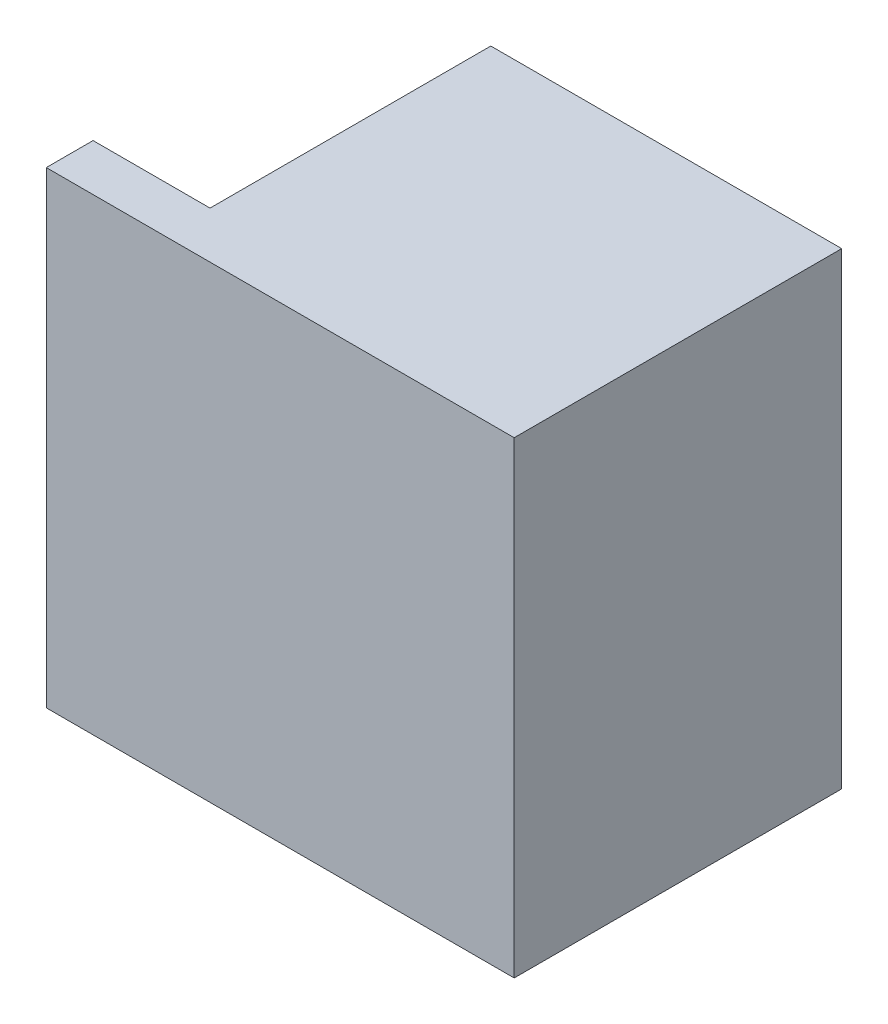
ISO-10303-21;
HEADER;
FILE_DESCRIPTION(('STEP AP214'),'2;1');
FILE_NAME('part.step','',(''),(''),'','','');
FILE_SCHEMA(('AUTOMOTIVE_DESIGN { 1 0 10303 214 1 1 1 1 }'));
ENDSEC;
DATA;
#1=APPLICATION_CONTEXT('core data for automotive mechanical design processes');
#2=APPLICATION_PROTOCOL_DEFINITION('international standard','automotive_design',2000,#1);
#3=PRODUCT_CONTEXT('',#1,'mechanical');
#4=PRODUCT('Part','Part','',(#3));
#5=PRODUCT_RELATED_PRODUCT_CATEGORY('part','',(#4));
#6=PRODUCT_DEFINITION_FORMATION('','',#4);
#7=PRODUCT_DEFINITION_CONTEXT('part definition',#1,'design');
#8=PRODUCT_DEFINITION('design','',#6,#7);
#9=PRODUCT_DEFINITION_SHAPE('','',#8);
#10=(LENGTH_UNIT() NAMED_UNIT(*) SI_UNIT(.MILLI.,.METRE.));
#11=(NAMED_UNIT(*) PLANE_ANGLE_UNIT() SI_UNIT($,.RADIAN.));
#12=(NAMED_UNIT(*) SI_UNIT($,.STERADIAN.) SOLID_ANGLE_UNIT());
#13=UNCERTAINTY_MEASURE_WITH_UNIT(LENGTH_MEASURE(1.E-05),#10,'distance_accuracy_value','');
#14=(GEOMETRIC_REPRESENTATION_CONTEXT(3) GLOBAL_UNCERTAINTY_ASSIGNED_CONTEXT((#13)) GLOBAL_UNIT_ASSIGNED_CONTEXT((#10,
#11,#12)) REPRESENTATION_CONTEXT('',''));
#15=CARTESIAN_POINT('',(0.,0.,0.));
#16=DIRECTION('',(0.,0.,1.));
#17=DIRECTION('',(1.,0.,0.));
#18=AXIS2_PLACEMENT_3D('',#15,#16,#17);
#19=CARTESIAN_POINT('',(-10.,10.,14.));
#20=DIRECTION('',(1.,0.,0.));
#21=DIRECTION('',(0.,1.,0.));
#22=AXIS2_PLACEMENT_3D('',#19,#20,#21);
#23=PLANE('',#22);
#24=DIRECTION('',(0.,-1.,0.));
#25=VECTOR('',#24,1.);
#26=CARTESIAN_POINT('',(-10.,10.,12.));
#27=LINE('',#26,#25);
#28=CARTESIAN_POINT('',(-10.,10.,12.));
#29=VERTEX_POINT('',#28);
#30=CARTESIAN_POINT('',(-10.,-10.,12.));
#31=VERTEX_POINT('',#30);
#32=EDGE_CURVE('E237',#29,#31,#27,.T.);
#33=ORIENTED_EDGE('',*,*,#32,.T.);
#34=DIRECTION('',(0.,0.,-1.));
#35=VECTOR('',#34,1.);
#36=CARTESIAN_POINT('',(-10.,-10.,14.));
#37=LINE('',#36,#35);
#38=CARTESIAN_POINT('',(-10.,-10.,14.));
#39=VERTEX_POINT('',#38);
#40=EDGE_CURVE('E12',#39,#31,#37,.T.);
#41=ORIENTED_EDGE('',*,*,#40,.F.);
#42=DIRECTION('',(0.,-1.,0.));
#43=VECTOR('',#42,1.);
#44=CARTESIAN_POINT('',(-10.,10.,14.));
#45=LINE('',#44,#43);
#46=CARTESIAN_POINT('',(-10.,10.,14.));
#47=VERTEX_POINT('',#46);
#48=EDGE_CURVE('E188',#47,#39,#45,.T.);
#49=ORIENTED_EDGE('',*,*,#48,.F.);
#50=DIRECTION('',(0.,0.,-1.));
#51=VECTOR('',#50,1.);
#52=CARTESIAN_POINT('',(-10.,10.,14.));
#53=LINE('',#52,#51);
#54=EDGE_CURVE('E195',#47,#29,#53,.T.);
#55=ORIENTED_EDGE('',*,*,#54,.T.);
#56=EDGE_LOOP('',(#33,#41,#49,#55));
#57=FACE_BOUND('',#56,.T.);
#58=ADVANCED_FACE('F35',(#57),#23,.F.);
#59=CARTESIAN_POINT('',(10.,-10.,14.));
#60=DIRECTION('',(0.,1.,0.));
#61=DIRECTION('',(-1.,0.,0.));
#62=AXIS2_PLACEMENT_3D('',#59,#60,#61);
#63=PLANE('',#62);
#64=DIRECTION('',(1.,0.,0.));
#65=VECTOR('',#64,1.);
#66=CARTESIAN_POINT('',(-10.,-10.,12.));
#67=LINE('',#66,#65);
#68=CARTESIAN_POINT('',(5.,-10.,12.));
#69=VERTEX_POINT('',#68);
#70=EDGE_CURVE('E234',#31,#69,#67,.T.);
#71=ORIENTED_EDGE('',*,*,#70,.T.);
#72=DIRECTION('',(0.,0.,-1.));
#73=VECTOR('',#72,1.);
#74=CARTESIAN_POINT('',(5.,-10.,40.9072480941474));
#75=LINE('',#74,#73);
#76=CARTESIAN_POINT('',(5.,-10.,0.));
#77=VERTEX_POINT('',#76);
#78=EDGE_CURVE('E171',#69,#77,#75,.T.);
#79=ORIENTED_EDGE('',*,*,#78,.T.);
#80=DIRECTION('',(1.,0.,0.));
#81=VECTOR('',#80,1.);
#82=CARTESIAN_POINT('',(10.,-10.,0.));
#83=LINE('',#82,#81);
#84=CARTESIAN_POINT('',(10.,-10.,0.));
#85=VERTEX_POINT('',#84);
#86=EDGE_CURVE('E186',#77,#85,#83,.T.);
#87=ORIENTED_EDGE('',*,*,#86,.T.);
#88=DIRECTION('',(0.,0.,-1.));
#89=VECTOR('',#88,1.);
#90=CARTESIAN_POINT('',(10.,-10.,14.));
#91=LINE('',#90,#89);
#92=CARTESIAN_POINT('',(10.,-10.,14.));
#93=VERTEX_POINT('',#92);
#94=EDGE_CURVE('E42',#93,#85,#91,.T.);
#95=ORIENTED_EDGE('',*,*,#94,.F.);
#96=DIRECTION('',(1.,0.,0.));
#97=VECTOR('',#96,1.);
#98=CARTESIAN_POINT('',(10.,-10.,14.));
#99=LINE('',#98,#97);
#100=EDGE_CURVE('E81',#39,#93,#99,.T.);
#101=ORIENTED_EDGE('',*,*,#100,.F.);
#102=ORIENTED_EDGE('',*,*,#40,.T.);
#103=EDGE_LOOP('',(#71,#79,#87,#95,#101,#102));
#104=FACE_BOUND('',#103,.T.);
#105=ADVANCED_FACE('F225',(#104),#63,.F.);
#106=CARTESIAN_POINT('',(10.,10.,14.));
#107=DIRECTION('',(-1.,0.,0.));
#108=DIRECTION('',(0.,-1.,0.));
#109=AXIS2_PLACEMENT_3D('',#106,#107,#108);
#110=PLANE('',#109);
#111=DIRECTION('',(0.,1.,0.));
#112=VECTOR('',#111,1.);
#113=CARTESIAN_POINT('',(10.,10.,0.));
#114=LINE('',#113,#112);
#115=CARTESIAN_POINT('',(10.,10.,0.));
#116=VERTEX_POINT('',#115);
#117=EDGE_CURVE('E74',#85,#116,#114,.T.);
#118=ORIENTED_EDGE('',*,*,#117,.T.);
#119=DIRECTION('',(0.,0.,-1.));
#120=VECTOR('',#119,1.);
#121=CARTESIAN_POINT('',(10.,10.,14.));
#122=LINE('',#121,#120);
#123=CARTESIAN_POINT('',(10.,10.,14.));
#124=VERTEX_POINT('',#123);
#125=EDGE_CURVE('E201',#124,#116,#122,.T.);
#126=ORIENTED_EDGE('',*,*,#125,.F.);
#127=DIRECTION('',(0.,1.,0.));
#128=VECTOR('',#127,1.);
#129=CARTESIAN_POINT('',(10.,10.,14.));
#130=LINE('',#129,#128);
#131=EDGE_CURVE('E192',#93,#124,#130,.T.);
#132=ORIENTED_EDGE('',*,*,#131,.F.);
#133=ORIENTED_EDGE('',*,*,#94,.T.);
#134=EDGE_LOOP('',(#118,#126,#132,#133));
#135=FACE_BOUND('',#134,.T.);
#136=ADVANCED_FACE('F203',(#135),#110,.F.);
#137=CARTESIAN_POINT('',(10.,10.,14.));
#138=DIRECTION('',(0.,-1.,0.));
#139=DIRECTION('',(1.,0.,0.));
#140=AXIS2_PLACEMENT_3D('',#137,#138,#139);
#141=PLANE('',#140);
#142=DIRECTION('',(-1.,0.,0.));
#143=VECTOR('',#142,1.);
#144=CARTESIAN_POINT('',(10.,10.,0.));
#145=LINE('',#144,#143);
#146=CARTESIAN_POINT('',(-5.,10.,0.));
#147=VERTEX_POINT('',#146);
#148=EDGE_CURVE('E190',#116,#147,#145,.T.);
#149=ORIENTED_EDGE('',*,*,#148,.T.);
#150=DIRECTION('',(0.,0.,-1.));
#151=VECTOR('',#150,1.);
#152=CARTESIAN_POINT('',(-5.,10.,40.9072480941474));
#153=LINE('',#152,#151);
#154=CARTESIAN_POINT('',(-5.,10.,12.));
#155=VERTEX_POINT('',#154);
#156=EDGE_CURVE('E49',#155,#147,#153,.T.);
#157=ORIENTED_EDGE('',*,*,#156,.F.);
#158=DIRECTION('',(-1.,0.,0.));
#159=VECTOR('',#158,1.);
#160=CARTESIAN_POINT('',(-10.,10.,12.));
#161=LINE('',#160,#159);
#162=EDGE_CURVE('E187',#155,#29,#161,.T.);
#163=ORIENTED_EDGE('',*,*,#162,.T.);
#164=ORIENTED_EDGE('',*,*,#54,.F.);
#165=DIRECTION('',(-1.,0.,0.));
#166=VECTOR('',#165,1.);
#167=CARTESIAN_POINT('',(10.,10.,14.));
#168=LINE('',#167,#166);
#169=EDGE_CURVE('E58',#124,#47,#168,.T.);
#170=ORIENTED_EDGE('',*,*,#169,.F.);
#171=ORIENTED_EDGE('',*,*,#125,.T.);
#172=EDGE_LOOP('',(#149,#157,#163,#164,#170,#171));
#173=FACE_BOUND('',#172,.T.);
#174=ADVANCED_FACE('F206',(#173),#141,.F.);
#175=CARTESIAN_POINT('',(0.,0.,14.));
#176=DIRECTION('',(0.,0.,-1.));
#177=DIRECTION('',(-1.,0.,0.));
#178=AXIS2_PLACEMENT_3D('',#175,#176,#177);
#179=PLANE('',#178);
#180=ORIENTED_EDGE('',*,*,#48,.T.);
#181=ORIENTED_EDGE('',*,*,#100,.T.);
#182=ORIENTED_EDGE('',*,*,#131,.T.);
#183=ORIENTED_EDGE('',*,*,#169,.T.);
#184=EDGE_LOOP('',(#180,#181,#182,#183));
#185=FACE_BOUND('',#184,.T.);
#186=ADVANCED_FACE('F213',(#185),#179,.F.);
#187=CARTESIAN_POINT('',(0.,0.,0.));
#188=DIRECTION('',(0.,0.,-1.));
#189=DIRECTION('',(-1.,0.,0.));
#190=AXIS2_PLACEMENT_3D('',#187,#188,#189);
#191=PLANE('',#190);
#192=DIRECTION('',(0.,-1.,0.));
#193=VECTOR('',#192,1.);
#194=CARTESIAN_POINT('',(5.,-8.,0.));
#195=LINE('',#194,#193);
#196=CARTESIAN_POINT('',(5.,-8.,0.));
#197=VERTEX_POINT('',#196);
#198=EDGE_CURVE('E169',#197,#77,#195,.T.);
#199=ORIENTED_EDGE('',*,*,#198,.F.);
#200=DIRECTION('',(-1.,0.,0.));
#201=VECTOR('',#200,1.);
#202=CARTESIAN_POINT('',(5.,-8.,0.));
#203=LINE('',#202,#201);
#204=CARTESIAN_POINT('',(8.,-8.,0.));
#205=VERTEX_POINT('',#204);
#206=EDGE_CURVE('E166',#205,#197,#203,.T.);
#207=ORIENTED_EDGE('',*,*,#206,.F.);
#208=DIRECTION('',(0.,-1.,0.));
#209=VECTOR('',#208,1.);
#210=CARTESIAN_POINT('',(8.,8.,0.));
#211=LINE('',#210,#209);
#212=CARTESIAN_POINT('',(8.,8.,0.));
#213=VERTEX_POINT('',#212);
#214=EDGE_CURVE('E163',#213,#205,#211,.T.);
#215=ORIENTED_EDGE('',*,*,#214,.F.);
#216=DIRECTION('',(1.,0.,0.));
#217=VECTOR('',#216,1.);
#218=CARTESIAN_POINT('',(-3.,8.,0.));
#219=LINE('',#218,#217);
#220=CARTESIAN_POINT('',(-3.,8.,0.));
#221=VERTEX_POINT('',#220);
#222=EDGE_CURVE('E157',#221,#213,#219,.T.);
#223=ORIENTED_EDGE('',*,*,#222,.F.);
#224=DIRECTION('',(0.,1.,0.));
#225=VECTOR('',#224,1.);
#226=CARTESIAN_POINT('',(-3.,8.,0.));
#227=LINE('',#226,#225);
#228=CARTESIAN_POINT('',(-3.,3.,0.));
#229=VERTEX_POINT('',#228);
#230=EDGE_CURVE('E155',#229,#221,#227,.T.);
#231=ORIENTED_EDGE('',*,*,#230,.F.);
#232=DIRECTION('',(1.,0.,0.));
#233=VECTOR('',#232,1.);
#234=CARTESIAN_POINT('',(-3.,3.,0.));
#235=LINE('',#234,#233);
#236=CARTESIAN_POINT('',(-5.,3.,0.));
#237=VERTEX_POINT('',#236);
#238=EDGE_CURVE('E138',#237,#229,#235,.T.);
#239=ORIENTED_EDGE('',*,*,#238,.F.);
#240=DIRECTION('',(0.,-1.,0.));
#241=VECTOR('',#240,1.);
#242=CARTESIAN_POINT('',(-5.,3.,0.));
#243=LINE('',#242,#241);
#244=EDGE_CURVE('E145',#147,#237,#243,.T.);
#245=ORIENTED_EDGE('',*,*,#244,.F.);
#246=ORIENTED_EDGE('',*,*,#148,.F.);
#247=ORIENTED_EDGE('',*,*,#117,.F.);
#248=ORIENTED_EDGE('',*,*,#86,.F.);
#249=EDGE_LOOP('',(#199,#207,#215,#223,#231,#239,#245,#246,#247,#248));
#250=FACE_BOUND('',#249,.T.);
#251=ADVANCED_FACE('F152',(#250),#191,.T.);
#252=CARTESIAN_POINT('',(5.,-8.,40.9072480941474));
#253=DIRECTION('',(1.,0.,0.));
#254=DIRECTION('',(0.,0.,-1.));
#255=AXIS2_PLACEMENT_3D('',#252,#253,#254);
#256=PLANE('',#255);
#257=DIRECTION('',(0.,1.,0.));
#258=VECTOR('',#257,1.);
#259=CARTESIAN_POINT('',(5.,-8.,12.));
#260=LINE('',#259,#258);
#261=CARTESIAN_POINT('',(5.,-8.,12.));
#262=VERTEX_POINT('',#261);
#263=EDGE_CURVE('E238',#69,#262,#260,.T.);
#264=ORIENTED_EDGE('',*,*,#263,.T.);
#265=DIRECTION('',(0.,0.,-1.));
#266=VECTOR('',#265,1.);
#267=CARTESIAN_POINT('',(5.,-8.,40.9072480941474));
#268=LINE('',#267,#266);
#269=EDGE_CURVE('E174',#262,#197,#268,.T.);
#270=ORIENTED_EDGE('',*,*,#269,.T.);
#271=ORIENTED_EDGE('',*,*,#198,.T.);
#272=ORIENTED_EDGE('',*,*,#78,.F.);
#273=EDGE_LOOP('',(#264,#270,#271,#272));
#274=FACE_BOUND('',#273,.T.);
#275=ADVANCED_FACE('F220',(#274),#256,.F.);
#276=CARTESIAN_POINT('',(5.,-8.,40.9072480941474));
#277=DIRECTION('',(0.,-1.,0.));
#278=DIRECTION('',(1.,0.,0.));
#279=AXIS2_PLACEMENT_3D('',#276,#277,#278);
#280=PLANE('',#279);
#281=DIRECTION('',(1.,0.,0.));
#282=VECTOR('',#281,1.);
#283=CARTESIAN_POINT('',(5.,-8.,12.));
#284=LINE('',#283,#282);
#285=CARTESIAN_POINT('',(8.,-8.,12.));
#286=VERTEX_POINT('',#285);
#287=EDGE_CURVE('E241',#262,#286,#284,.T.);
#288=ORIENTED_EDGE('',*,*,#287,.T.);
#289=DIRECTION('',(0.,0.,-1.));
#290=VECTOR('',#289,1.);
#291=CARTESIAN_POINT('',(8.,-8.,40.9072480941474));
#292=LINE('',#291,#290);
#293=EDGE_CURVE('E176',#286,#205,#292,.T.);
#294=ORIENTED_EDGE('',*,*,#293,.T.);
#295=ORIENTED_EDGE('',*,*,#206,.T.);
#296=ORIENTED_EDGE('',*,*,#269,.F.);
#297=EDGE_LOOP('',(#288,#294,#295,#296));
#298=FACE_BOUND('',#297,.T.);
#299=ADVANCED_FACE('F265',(#298),#280,.F.);
#300=CARTESIAN_POINT('',(8.,8.,40.9072480941474));
#301=DIRECTION('',(1.,0.,0.));
#302=DIRECTION('',(0.,1.,0.));
#303=AXIS2_PLACEMENT_3D('',#300,#301,#302);
#304=PLANE('',#303);
#305=DIRECTION('',(0.,1.,0.));
#306=VECTOR('',#305,1.);
#307=CARTESIAN_POINT('',(8.,8.,12.));
#308=LINE('',#307,#306);
#309=CARTESIAN_POINT('',(8.,8.,12.));
#310=VERTEX_POINT('',#309);
#311=EDGE_CURVE('E245',#286,#310,#308,.T.);
#312=ORIENTED_EDGE('',*,*,#311,.T.);
#313=DIRECTION('',(0.,0.,-1.));
#314=VECTOR('',#313,1.);
#315=CARTESIAN_POINT('',(8.,8.,40.9072480941474));
#316=LINE('',#315,#314);
#317=EDGE_CURVE('E178',#310,#213,#316,.T.);
#318=ORIENTED_EDGE('',*,*,#317,.T.);
#319=ORIENTED_EDGE('',*,*,#214,.T.);
#320=ORIENTED_EDGE('',*,*,#293,.F.);
#321=EDGE_LOOP('',(#312,#318,#319,#320));
#322=FACE_BOUND('',#321,.T.);
#323=ADVANCED_FACE('F269',(#322),#304,.F.);
#324=CARTESIAN_POINT('',(-3.,8.,40.9072480941474));
#325=DIRECTION('',(0.,1.,0.));
#326=DIRECTION('',(-1.,0.,0.));
#327=AXIS2_PLACEMENT_3D('',#324,#325,#326);
#328=PLANE('',#327);
#329=DIRECTION('',(-1.,0.,0.));
#330=VECTOR('',#329,1.);
#331=CARTESIAN_POINT('',(-3.,8.,12.));
#332=LINE('',#331,#330);
#333=CARTESIAN_POINT('',(-3.,8.,12.));
#334=VERTEX_POINT('',#333);
#335=EDGE_CURVE('E247',#310,#334,#332,.T.);
#336=ORIENTED_EDGE('',*,*,#335,.T.);
#337=DIRECTION('',(0.,0.,-1.));
#338=VECTOR('',#337,1.);
#339=CARTESIAN_POINT('',(-3.,8.,40.9072480941474));
#340=LINE('',#339,#338);
#341=EDGE_CURVE('E180',#334,#221,#340,.T.);
#342=ORIENTED_EDGE('',*,*,#341,.T.);
#343=ORIENTED_EDGE('',*,*,#222,.T.);
#344=ORIENTED_EDGE('',*,*,#317,.F.);
#345=EDGE_LOOP('',(#336,#342,#343,#344));
#346=FACE_BOUND('',#345,.T.);
#347=ADVANCED_FACE('F273',(#346),#328,.F.);
#348=CARTESIAN_POINT('',(-3.,8.,40.9072480941474));
#349=DIRECTION('',(-1.,0.,0.));
#350=DIRECTION('',(0.,-1.,0.));
#351=AXIS2_PLACEMENT_3D('',#348,#349,#350);
#352=PLANE('',#351);
#353=DIRECTION('',(0.,-1.,0.));
#354=VECTOR('',#353,1.);
#355=CARTESIAN_POINT('',(-3.,8.,12.));
#356=LINE('',#355,#354);
#357=CARTESIAN_POINT('',(-3.,3.,12.));
#358=VERTEX_POINT('',#357);
#359=EDGE_CURVE('E249',#334,#358,#356,.T.);
#360=ORIENTED_EDGE('',*,*,#359,.T.);
#361=DIRECTION('',(0.,0.,-1.));
#362=VECTOR('',#361,1.);
#363=CARTESIAN_POINT('',(-3.,3.,40.9072480941474));
#364=LINE('',#363,#362);
#365=EDGE_CURVE('E143',#358,#229,#364,.T.);
#366=ORIENTED_EDGE('',*,*,#365,.T.);
#367=ORIENTED_EDGE('',*,*,#230,.T.);
#368=ORIENTED_EDGE('',*,*,#341,.F.);
#369=EDGE_LOOP('',(#360,#366,#367,#368));
#370=FACE_BOUND('',#369,.T.);
#371=ADVANCED_FACE('F254',(#370),#352,.F.);
#372=CARTESIAN_POINT('',(-3.,3.,40.9072480941474));
#373=DIRECTION('',(0.,1.,0.));
#374=DIRECTION('',(0.,0.,1.));
#375=AXIS2_PLACEMENT_3D('',#372,#373,#374);
#376=PLANE('',#375);
#377=DIRECTION('',(-1.,0.,0.));
#378=VECTOR('',#377,1.);
#379=CARTESIAN_POINT('',(-3.,3.,12.));
#380=LINE('',#379,#378);
#381=CARTESIAN_POINT('',(-5.,3.,12.));
#382=VERTEX_POINT('',#381);
#383=EDGE_CURVE('E141',#358,#382,#380,.T.);
#384=ORIENTED_EDGE('',*,*,#383,.T.);
#385=DIRECTION('',(0.,0.,-1.));
#386=VECTOR('',#385,1.);
#387=CARTESIAN_POINT('',(-5.,3.,40.9072480941474));
#388=LINE('',#387,#386);
#389=EDGE_CURVE('E134',#382,#237,#388,.T.);
#390=ORIENTED_EDGE('',*,*,#389,.T.);
#391=ORIENTED_EDGE('',*,*,#238,.T.);
#392=ORIENTED_EDGE('',*,*,#365,.F.);
#393=EDGE_LOOP('',(#384,#390,#391,#392));
#394=FACE_BOUND('',#393,.T.);
#395=ADVANCED_FACE('F135',(#394),#376,.F.);
#396=CARTESIAN_POINT('',(-5.,3.,40.9072480941474));
#397=DIRECTION('',(1.,0.,0.));
#398=DIRECTION('',(0.,0.,-1.));
#399=AXIS2_PLACEMENT_3D('',#396,#397,#398);
#400=PLANE('',#399);
#401=DIRECTION('',(0.,1.,0.));
#402=VECTOR('',#401,1.);
#403=CARTESIAN_POINT('',(-5.,3.,12.));
#404=LINE('',#403,#402);
#405=EDGE_CURVE('E184',#382,#155,#404,.T.);
#406=ORIENTED_EDGE('',*,*,#405,.T.);
#407=ORIENTED_EDGE('',*,*,#156,.T.);
#408=ORIENTED_EDGE('',*,*,#244,.T.);
#409=ORIENTED_EDGE('',*,*,#389,.F.);
#410=EDGE_LOOP('',(#406,#407,#408,#409));
#411=FACE_BOUND('',#410,.T.);
#412=ADVANCED_FACE('F146',(#411),#400,.F.);
#413=CARTESIAN_POINT('',(0.,0.,12.));
#414=DIRECTION('',(0.,0.,-1.));
#415=DIRECTION('',(-1.,0.,0.));
#416=AXIS2_PLACEMENT_3D('',#413,#414,#415);
#417=PLANE('',#416);
#418=ORIENTED_EDGE('',*,*,#162,.F.);
#419=ORIENTED_EDGE('',*,*,#405,.F.);
#420=ORIENTED_EDGE('',*,*,#383,.F.);
#421=ORIENTED_EDGE('',*,*,#359,.F.);
#422=ORIENTED_EDGE('',*,*,#335,.F.);
#423=ORIENTED_EDGE('',*,*,#311,.F.);
#424=ORIENTED_EDGE('',*,*,#287,.F.);
#425=ORIENTED_EDGE('',*,*,#263,.F.);
#426=ORIENTED_EDGE('',*,*,#70,.F.);
#427=ORIENTED_EDGE('',*,*,#32,.F.);
#428=EDGE_LOOP('',(#418,#419,#420,#421,#422,#423,#424,#425,#426,#427));
#429=FACE_BOUND('',#428,.T.);
#430=ADVANCED_FACE('F256',(#429),#417,.T.);
#431=CLOSED_SHELL('',(#58,#105,#136,#174,#186,#251,#275,#299,#323,#347,#371,#395,#412,#430));
#432=MANIFOLD_SOLID_BREP('B2',#431);
#433=ADVANCED_BREP_SHAPE_REPRESENTATION('',(#18,#432),#14);
#434=SHAPE_DEFINITION_REPRESENTATION(#9,#433);
ENDSEC;
END-ISO-10303-21;
